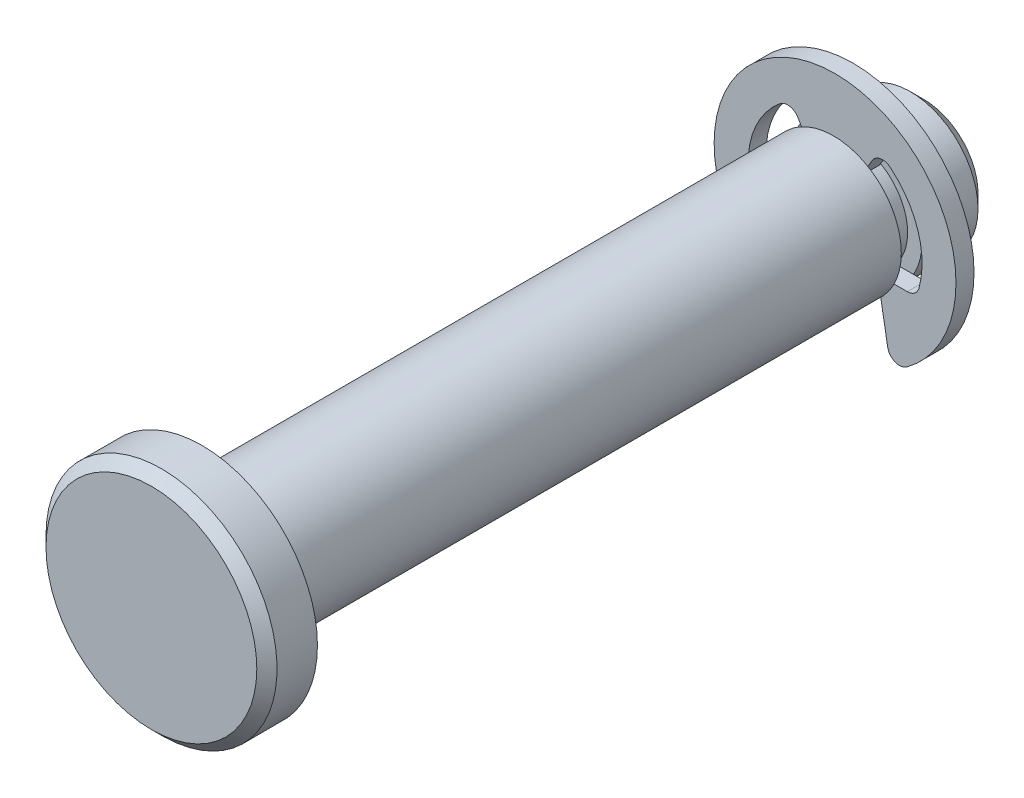
ISO-10303-21;
HEADER;
FILE_DESCRIPTION(('STEP AP214'),'2;1');
FILE_NAME('part.step','',(''),(''),'','','');
FILE_SCHEMA(('AUTOMOTIVE_DESIGN { 1 0 10303 214 1 1 1 1 }'));
ENDSEC;
DATA;
#1=APPLICATION_CONTEXT('core data for automotive mechanical design processes');
#2=APPLICATION_PROTOCOL_DEFINITION('international standard','automotive_design',2000,#1);
#3=PRODUCT_CONTEXT('',#1,'mechanical');
#4=PRODUCT('Part','Part','',(#3));
#5=PRODUCT_RELATED_PRODUCT_CATEGORY('part','',(#4));
#6=PRODUCT_DEFINITION_FORMATION('','',#4);
#7=PRODUCT_DEFINITION_CONTEXT('part definition',#1,'design');
#8=PRODUCT_DEFINITION('design','',#6,#7);
#9=PRODUCT_DEFINITION_SHAPE('','',#8);
#10=(LENGTH_UNIT() NAMED_UNIT(*) SI_UNIT(.MILLI.,.METRE.));
#11=(NAMED_UNIT(*) PLANE_ANGLE_UNIT() SI_UNIT($,.RADIAN.));
#12=(NAMED_UNIT(*) SI_UNIT($,.STERADIAN.) SOLID_ANGLE_UNIT());
#13=UNCERTAINTY_MEASURE_WITH_UNIT(LENGTH_MEASURE(1.E-05),#10,'distance_accuracy_value','');
#14=(GEOMETRIC_REPRESENTATION_CONTEXT(3) GLOBAL_UNCERTAINTY_ASSIGNED_CONTEXT((#13)) GLOBAL_UNIT_ASSIGNED_CONTEXT((#10,
#11,#12)) REPRESENTATION_CONTEXT('',''));
#15=CARTESIAN_POINT('',(0.,0.,0.));
#16=DIRECTION('',(0.,0.,1.));
#17=DIRECTION('',(1.,0.,0.));
#18=AXIS2_PLACEMENT_3D('',#15,#16,#17);
#19=CARTESIAN_POINT('',(0.,0.,-9.5758));
#20=DIRECTION('',(0.,0.,1.));
#21=DIRECTION('',(1.,0.,0.));
#22=AXIS2_PLACEMENT_3D('',#19,#20,#21);
#23=PLANE('',#22);
#24=DIRECTION('',(-0.173648177666931,0.984807753012208,0.));
#25=VECTOR('',#24,1.);
#26=CARTESIAN_POINT('',(1.25692963982568,0.22163060835344,-9.5758));
#27=LINE('',#26,#25);
#28=CARTESIAN_POINT('',(1.85256069501915,-3.15636096616503,-9.5758));
#29=VERTEX_POINT('',#28);
#30=CARTESIAN_POINT('',(1.49352,-1.12014,-9.5758));
#31=VERTEX_POINT('',#30);
#32=EDGE_CURVE('E200',#29,#31,#27,.T.);
#33=ORIENTED_EDGE('',*,*,#32,.F.);
#34=CARTESIAN_POINT('',(2.2715471535382,-3.08248234897663,-9.5758));
#35=DIRECTION('',(0.,0.,1.));
#36=DIRECTION('',(1.,0.,0.));
#37=AXIS2_PLACEMENT_3D('',#34,#35,#36);
#38=CIRCLE('',#37,0.42545);
#39=CARTESIAN_POINT('',(2.52394128170911,-3.42498038775182,-9.5758));
#40=VERTEX_POINT('',#39);
#41=EDGE_CURVE('E254',#29,#40,#38,.T.);
#42=ORIENTED_EDGE('',*,*,#41,.T.);
#43=CARTESIAN_POINT('',(0.,0.,-9.5758));
#44=DIRECTION('',(0.,0.,1.));
#45=DIRECTION('',(1.,0.,0.));
#46=AXIS2_PLACEMENT_3D('',#43,#44,#45);
#47=CIRCLE('',#46,4.2545);
#48=CARTESIAN_POINT('',(-2.52394128170911,-3.42498038775182,-9.5758));
#49=VERTEX_POINT('',#48);
#50=EDGE_CURVE('E180',#40,#49,#47,.T.);
#51=ORIENTED_EDGE('',*,*,#50,.T.);
#52=CARTESIAN_POINT('',(-2.2715471535382,-3.08248234897663,-9.5758));
#53=DIRECTION('',(0.,0.,1.));
#54=DIRECTION('',(1.,0.,0.));
#55=AXIS2_PLACEMENT_3D('',#52,#53,#54);
#56=CIRCLE('',#55,0.42545);
#57=CARTESIAN_POINT('',(-1.85256069501915,-3.15636096616503,-9.5758));
#58=VERTEX_POINT('',#57);
#59=EDGE_CURVE('E252',#49,#58,#56,.T.);
#60=ORIENTED_EDGE('',*,*,#59,.T.);
#61=DIRECTION('',(-0.173648177666931,-0.984807753012208,0.));
#62=VECTOR('',#61,1.);
#63=CARTESIAN_POINT('',(-1.25692963982568,0.22163060835344,-9.5758));
#64=LINE('',#63,#62);
#65=CARTESIAN_POINT('',(-1.49352,-1.12014,-9.5758));
#66=VERTEX_POINT('',#65);
#67=EDGE_CURVE('E196',#66,#58,#64,.T.);
#68=ORIENTED_EDGE('',*,*,#67,.F.);
#69=DIRECTION('',(1.,0.,0.));
#70=VECTOR('',#69,1.);
#71=CARTESIAN_POINT('',(0.,-1.12014,-9.5758));
#72=LINE('',#71,#70);
#73=CARTESIAN_POINT('',(-2.54203626378539,-1.12014,-9.5758));
#74=VERTEX_POINT('',#73);
#75=EDGE_CURVE('E187',#74,#66,#72,.T.);
#76=ORIENTED_EDGE('',*,*,#75,.F.);
#77=CARTESIAN_POINT('',(-2.54203626378539,-0.69469,-9.5758));
#78=DIRECTION('',(0.,0.,1.));
#79=DIRECTION('',(1.,0.,0.));
#80=AXIS2_PLACEMENT_3D('',#77,#78,#79);
#81=CIRCLE('',#80,0.42545);
#82=CARTESIAN_POINT('',(-2.95243729914352,-0.806844771084337,-9.5758));
#83=VERTEX_POINT('',#82);
#84=EDGE_CURVE('E52',#74,#83,#81,.F.);
#85=ORIENTED_EDGE('',*,*,#84,.T.);
#86=CARTESIAN_POINT('',(0.,0.,-9.5758));
#87=DIRECTION('',(0.,0.,1.));
#88=DIRECTION('',(1.,0.,0.));
#89=AXIS2_PLACEMENT_3D('',#86,#87,#88);
#90=CIRCLE('',#89,3.0607);
#91=CARTESIAN_POINT('',(-1.93820951958955,2.36880314677528,-9.5758));
#92=VERTEX_POINT('',#91);
#93=EDGE_CURVE('E212',#92,#83,#90,.T.);
#94=ORIENTED_EDGE('',*,*,#93,.F.);
#95=CARTESIAN_POINT('',(-1.66879035400345,2.03952968031481,-9.5758));
#96=DIRECTION('',(0.,0.,1.));
#97=DIRECTION('',(1.,0.,0.));
#98=AXIS2_PLACEMENT_3D('',#95,#96,#97);
#99=CIRCLE('',#98,0.42545);
#100=CARTESIAN_POINT('',(-1.30033984596336,2.25225468031482,-9.5758));
#101=VERTEX_POINT('',#100);
#102=EDGE_CURVE('E184',#92,#101,#99,.F.);
#103=ORIENTED_EDGE('',*,*,#102,.T.);
#104=DIRECTION('',(-0.500000000000002,0.866025403784438,0.));
#105=VECTOR('',#104,1.);
#106=CARTESIAN_POINT('',(0.,0.,-9.5758));
#107=LINE('',#106,#105);
#108=CARTESIAN_POINT('',(-0.933450000000003,1.61678282632517,-9.5758));
#109=VERTEX_POINT('',#108);
#110=EDGE_CURVE('E176',#109,#101,#107,.T.);
#111=ORIENTED_EDGE('',*,*,#110,.F.);
#112=DIRECTION('',(1.,0.,0.));
#113=VECTOR('',#112,1.);
#114=CARTESIAN_POINT('',(-0.933450000000003,1.61678282632517,-9.5758));
#115=LINE('',#114,#113);
#116=CARTESIAN_POINT('',(0.933450000000003,1.61678282632517,-9.5758));
#117=VERTEX_POINT('',#116);
#118=EDGE_CURVE('E160',#109,#117,#115,.T.);
#119=ORIENTED_EDGE('',*,*,#118,.T.);
#120=DIRECTION('',(-0.500000000000002,-0.866025403784438,0.));
#121=VECTOR('',#120,1.);
#122=CARTESIAN_POINT('',(0.,0.,-9.5758));
#123=LINE('',#122,#121);
#124=CARTESIAN_POINT('',(1.30033984596336,2.25225468031482,-9.5758));
#125=VERTEX_POINT('',#124);
#126=EDGE_CURVE('E210',#125,#117,#123,.T.);
#127=ORIENTED_EDGE('',*,*,#126,.F.);
#128=CARTESIAN_POINT('',(1.66879035400345,2.03952968031482,-9.5758));
#129=DIRECTION('',(0.,0.,1.));
#130=DIRECTION('',(1.,0.,0.));
#131=AXIS2_PLACEMENT_3D('',#128,#129,#130);
#132=CIRCLE('',#131,0.42545);
#133=CARTESIAN_POINT('',(1.93820951958955,2.36880314677528,-9.5758));
#134=VERTEX_POINT('',#133);
#135=EDGE_CURVE('E269',#125,#134,#132,.F.);
#136=ORIENTED_EDGE('',*,*,#135,.T.);
#137=CARTESIAN_POINT('',(0.,0.,-9.5758));
#138=DIRECTION('',(0.,0.,1.));
#139=DIRECTION('',(1.,0.,0.));
#140=AXIS2_PLACEMENT_3D('',#137,#138,#139);
#141=CIRCLE('',#140,3.0607);
#142=CARTESIAN_POINT('',(2.95243729914352,-0.806844771084337,-9.5758));
#143=VERTEX_POINT('',#142);
#144=EDGE_CURVE('E215',#143,#134,#141,.T.);
#145=ORIENTED_EDGE('',*,*,#144,.F.);
#146=CARTESIAN_POINT('',(2.54203626378539,-0.69469,-9.5758));
#147=DIRECTION('',(0.,0.,1.));
#148=DIRECTION('',(1.,0.,0.));
#149=AXIS2_PLACEMENT_3D('',#146,#147,#148);
#150=CIRCLE('',#149,0.42545);
#151=CARTESIAN_POINT('',(2.54203626378539,-1.12014,-9.5758));
#152=VERTEX_POINT('',#151);
#153=EDGE_CURVE('E265',#143,#152,#150,.F.);
#154=ORIENTED_EDGE('',*,*,#153,.T.);
#155=DIRECTION('',(1.,0.,0.));
#156=VECTOR('',#155,1.);
#157=CARTESIAN_POINT('',(0.,-1.12014,-9.5758));
#158=LINE('',#157,#156);
#159=EDGE_CURVE('E205',#31,#152,#158,.T.);
#160=ORIENTED_EDGE('',*,*,#159,.F.);
#161=EDGE_LOOP('',(#33,#42,#51,#60,#68,#76,#85,#94,#103,#111,#119,#127,#136,#145,#154,#160));
#162=FACE_BOUND('',#161,.T.);
#163=ADVANCED_FACE('F44',(#162),#23,.T.);
#164=CARTESIAN_POINT('',(0.,0.,-10.2108));
#165=DIRECTION('',(0.,0.,1.));
#166=DIRECTION('',(1.,0.,0.));
#167=AXIS2_PLACEMENT_3D('',#164,#165,#166);
#168=PLANE('',#167);
#169=CARTESIAN_POINT('',(0.,0.,-10.2108));
#170=DIRECTION('',(0.,0.,1.));
#171=DIRECTION('',(1.,0.,0.));
#172=AXIS2_PLACEMENT_3D('',#169,#170,#171);
#173=CIRCLE('',#172,4.2545);
#174=CARTESIAN_POINT('',(2.52394128170911,-3.42498038775182,-10.2108));
#175=VERTEX_POINT('',#174);
#176=CARTESIAN_POINT('',(-2.52394128170911,-3.42498038775182,-10.2108));
#177=VERTEX_POINT('',#176);
#178=EDGE_CURVE('E218',#175,#177,#173,.T.);
#179=ORIENTED_EDGE('',*,*,#178,.F.);
#180=CARTESIAN_POINT('',(2.2715471535382,-3.08248234897663,-10.2108));
#181=DIRECTION('',(0.,0.,1.));
#182=DIRECTION('',(1.,0.,0.));
#183=AXIS2_PLACEMENT_3D('',#180,#181,#182);
#184=CIRCLE('',#183,0.42545);
#185=CARTESIAN_POINT('',(1.85256069501915,-3.15636096616503,-10.2108));
#186=VERTEX_POINT('',#185);
#187=EDGE_CURVE('E262',#175,#186,#184,.F.);
#188=ORIENTED_EDGE('',*,*,#187,.T.);
#189=DIRECTION('',(-0.173648177666931,0.984807753012208,0.));
#190=VECTOR('',#189,1.);
#191=CARTESIAN_POINT('',(1.25692963982568,0.22163060835344,-10.2108));
#192=LINE('',#191,#190);
#193=CARTESIAN_POINT('',(1.49352,-1.12014,-10.2108));
#194=VERTEX_POINT('',#193);
#195=EDGE_CURVE('E198',#186,#194,#192,.T.);
#196=ORIENTED_EDGE('',*,*,#195,.T.);
#197=DIRECTION('',(1.,0.,0.));
#198=VECTOR('',#197,1.);
#199=CARTESIAN_POINT('',(0.,-1.12014,-10.2108));
#200=LINE('',#199,#198);
#201=CARTESIAN_POINT('',(2.54203626378539,-1.12014,-10.2108));
#202=VERTEX_POINT('',#201);
#203=EDGE_CURVE('E202',#194,#202,#200,.T.);
#204=ORIENTED_EDGE('',*,*,#203,.T.);
#205=CARTESIAN_POINT('',(2.54203626378539,-0.69469,-10.2108));
#206=DIRECTION('',(0.,0.,1.));
#207=DIRECTION('',(1.,0.,0.));
#208=AXIS2_PLACEMENT_3D('',#205,#206,#207);
#209=CIRCLE('',#208,0.42545);
#210=CARTESIAN_POINT('',(2.95243729914352,-0.806844771084337,-10.2108));
#211=VERTEX_POINT('',#210);
#212=EDGE_CURVE('E267',#202,#211,#209,.T.);
#213=ORIENTED_EDGE('',*,*,#212,.T.);
#214=CARTESIAN_POINT('',(0.,0.,-10.2108));
#215=DIRECTION('',(0.,0.,1.));
#216=DIRECTION('',(1.,0.,0.));
#217=AXIS2_PLACEMENT_3D('',#214,#215,#216);
#218=CIRCLE('',#217,3.0607);
#219=CARTESIAN_POINT('',(1.93820951958955,2.36880314677528,-10.2108));
#220=VERTEX_POINT('',#219);
#221=EDGE_CURVE('E226',#211,#220,#218,.T.);
#222=ORIENTED_EDGE('',*,*,#221,.T.);
#223=CARTESIAN_POINT('',(1.66879035400345,2.03952968031482,-10.2108));
#224=DIRECTION('',(0.,0.,1.));
#225=DIRECTION('',(1.,0.,0.));
#226=AXIS2_PLACEMENT_3D('',#223,#224,#225);
#227=CIRCLE('',#226,0.42545);
#228=CARTESIAN_POINT('',(1.30033984596336,2.25225468031482,-10.2108));
#229=VERTEX_POINT('',#228);
#230=EDGE_CURVE('E271',#220,#229,#227,.T.);
#231=ORIENTED_EDGE('',*,*,#230,.T.);
#232=DIRECTION('',(-0.500000000000002,-0.866025403784438,0.));
#233=VECTOR('',#232,1.);
#234=CARTESIAN_POINT('',(0.,0.,-10.2108));
#235=LINE('',#234,#233);
#236=CARTESIAN_POINT('',(0.933450000000003,1.61678282632517,-10.2108));
#237=VERTEX_POINT('',#236);
#238=EDGE_CURVE('E208',#229,#237,#235,.T.);
#239=ORIENTED_EDGE('',*,*,#238,.T.);
#240=DIRECTION('',(-1.,0.,0.));
#241=VECTOR('',#240,1.);
#242=CARTESIAN_POINT('',(-0.933450000000003,1.61678282632517,-10.2108));
#243=LINE('',#242,#241);
#244=CARTESIAN_POINT('',(-0.933450000000003,1.61678282632517,-10.2108));
#245=VERTEX_POINT('',#244);
#246=EDGE_CURVE('E171',#237,#245,#243,.T.);
#247=ORIENTED_EDGE('',*,*,#246,.T.);
#248=DIRECTION('',(-0.500000000000002,0.866025403784438,0.));
#249=VECTOR('',#248,1.);
#250=CARTESIAN_POINT('',(0.,0.,-10.2108));
#251=LINE('',#250,#249);
#252=CARTESIAN_POINT('',(-1.30033984596336,2.25225468031482,-10.2108));
#253=VERTEX_POINT('',#252);
#254=EDGE_CURVE('E179',#245,#253,#251,.T.);
#255=ORIENTED_EDGE('',*,*,#254,.T.);
#256=CARTESIAN_POINT('',(-1.66879035400345,2.03952968031481,-10.2108));
#257=DIRECTION('',(0.,0.,1.));
#258=DIRECTION('',(1.,0.,0.));
#259=AXIS2_PLACEMENT_3D('',#256,#257,#258);
#260=CIRCLE('',#259,0.42545);
#261=CARTESIAN_POINT('',(-1.93820951958955,2.36880314677528,-10.2108));
#262=VERTEX_POINT('',#261);
#263=EDGE_CURVE('E274',#253,#262,#260,.T.);
#264=ORIENTED_EDGE('',*,*,#263,.T.);
#265=CARTESIAN_POINT('',(0.,0.,-10.2108));
#266=DIRECTION('',(0.,0.,1.));
#267=DIRECTION('',(1.,0.,0.));
#268=AXIS2_PLACEMENT_3D('',#265,#266,#267);
#269=CIRCLE('',#268,3.0607);
#270=CARTESIAN_POINT('',(-2.95243729914352,-0.806844771084337,-10.2108));
#271=VERTEX_POINT('',#270);
#272=EDGE_CURVE('E223',#262,#271,#269,.T.);
#273=ORIENTED_EDGE('',*,*,#272,.T.);
#274=CARTESIAN_POINT('',(-2.54203626378539,-0.69469,-10.2108));
#275=DIRECTION('',(0.,0.,1.));
#276=DIRECTION('',(1.,0.,0.));
#277=AXIS2_PLACEMENT_3D('',#274,#275,#276);
#278=CIRCLE('',#277,0.42545);
#279=CARTESIAN_POINT('',(-2.54203626378539,-1.12014,-10.2108));
#280=VERTEX_POINT('',#279);
#281=EDGE_CURVE('E13',#271,#280,#278,.T.);
#282=ORIENTED_EDGE('',*,*,#281,.T.);
#283=DIRECTION('',(1.,0.,0.));
#284=VECTOR('',#283,1.);
#285=CARTESIAN_POINT('',(0.,-1.12014,-10.2108));
#286=LINE('',#285,#284);
#287=CARTESIAN_POINT('',(-1.49352,-1.12014,-10.2108));
#288=VERTEX_POINT('',#287);
#289=EDGE_CURVE('E185',#280,#288,#286,.T.);
#290=ORIENTED_EDGE('',*,*,#289,.T.);
#291=DIRECTION('',(-0.173648177666931,-0.984807753012208,0.));
#292=VECTOR('',#291,1.);
#293=CARTESIAN_POINT('',(-1.25692963982568,0.22163060835344,-10.2108));
#294=LINE('',#293,#292);
#295=CARTESIAN_POINT('',(-1.85256069501915,-3.15636096616503,-10.2108));
#296=VERTEX_POINT('',#295);
#297=EDGE_CURVE('E194',#288,#296,#294,.T.);
#298=ORIENTED_EDGE('',*,*,#297,.T.);
#299=CARTESIAN_POINT('',(-2.2715471535382,-3.08248234897663,-10.2108));
#300=DIRECTION('',(0.,0.,1.));
#301=DIRECTION('',(1.,0.,0.));
#302=AXIS2_PLACEMENT_3D('',#299,#300,#301);
#303=CIRCLE('',#302,0.42545);
#304=EDGE_CURVE('E66',#296,#177,#303,.F.);
#305=ORIENTED_EDGE('',*,*,#304,.T.);
#306=EDGE_LOOP('',(#179,#188,#196,#204,#213,#222,#231,#239,#247,#255,#264,#273,#282,#290,#298,#305));
#307=FACE_BOUND('',#306,.T.);
#308=ADVANCED_FACE('F287',(#307),#168,.F.);
#309=CARTESIAN_POINT('',(0.,0.,-9.5758));
#310=DIRECTION('',(0.,0.,-1.));
#311=DIRECTION('',(-1.,0.,0.));
#312=AXIS2_PLACEMENT_3D('',#309,#310,#311);
#313=CYLINDRICAL_SURFACE('',#312,4.2545);
#314=ORIENTED_EDGE('',*,*,#50,.F.);
#315=DIRECTION('',(0.,0.,-1.));
#316=VECTOR('',#315,1.);
#317=CARTESIAN_POINT('',(2.52394128170911,-3.42498038775182,-9.5758));
#318=LINE('',#317,#316);
#319=EDGE_CURVE('E259',#40,#175,#318,.T.);
#320=ORIENTED_EDGE('',*,*,#319,.T.);
#321=ORIENTED_EDGE('',*,*,#178,.T.);
#322=DIRECTION('',(0.,0.,-1.));
#323=VECTOR('',#322,1.);
#324=CARTESIAN_POINT('',(-2.52394128170911,-3.42498038775182,-9.5758));
#325=LINE('',#324,#323);
#326=EDGE_CURVE('E256',#177,#49,#325,.F.);
#327=ORIENTED_EDGE('',*,*,#326,.T.);
#328=EDGE_LOOP('',(#314,#320,#321,#327));
#329=FACE_BOUND('',#328,.T.);
#330=ADVANCED_FACE('F327',(#329),#313,.T.);
#331=CARTESIAN_POINT('',(-1.49352,-1.12014,-12.7));
#332=DIRECTION('',(-0.984807753012208,0.173648177666931,0.));
#333=DIRECTION('',(-0.173648177666931,-0.984807753012208,0.));
#334=AXIS2_PLACEMENT_3D('',#331,#332,#333);
#335=PLANE('',#334);
#336=ORIENTED_EDGE('',*,*,#67,.T.);
#337=DIRECTION('',(0.,0.,-1.));
#338=VECTOR('',#337,1.);
#339=CARTESIAN_POINT('',(-1.85256069501915,-3.15636096616503,-12.7));
#340=LINE('',#339,#338);
#341=EDGE_CURVE('E59',#58,#296,#340,.T.);
#342=ORIENTED_EDGE('',*,*,#341,.T.);
#343=ORIENTED_EDGE('',*,*,#297,.F.);
#344=DIRECTION('',(0.,0.,1.));
#345=VECTOR('',#344,1.);
#346=CARTESIAN_POINT('',(-1.49352,-1.12014,-12.7));
#347=LINE('',#346,#345);
#348=EDGE_CURVE('E292',#288,#66,#347,.T.);
#349=ORIENTED_EDGE('',*,*,#348,.T.);
#350=EDGE_LOOP('',(#336,#342,#343,#349));
#351=FACE_BOUND('',#350,.T.);
#352=ADVANCED_FACE('F332',(#351),#335,.F.);
#353=CARTESIAN_POINT('',(-1.53035,2.65064395336303,-12.7));
#354=DIRECTION('',(0.866025403784438,0.500000000000002,0.));
#355=DIRECTION('',(-0.500000000000002,0.866025403784438,0.));
#356=AXIS2_PLACEMENT_3D('',#353,#354,#355);
#357=PLANE('',#356);
#358=ORIENTED_EDGE('',*,*,#110,.T.);
#359=DIRECTION('',(0.,0.,-1.));
#360=VECTOR('',#359,1.);
#361=CARTESIAN_POINT('',(-1.30033984596336,2.25225468031482,-10.2108));
#362=LINE('',#361,#360);
#363=EDGE_CURVE('E244',#101,#253,#362,.T.);
#364=ORIENTED_EDGE('',*,*,#363,.T.);
#365=ORIENTED_EDGE('',*,*,#254,.F.);
#366=DIRECTION('',(0.,0.,-1.));
#367=VECTOR('',#366,1.);
#368=CARTESIAN_POINT('',(-0.933450000000003,1.61678282632517,-9.5758));
#369=LINE('',#368,#367);
#370=EDGE_CURVE('E164',#245,#109,#369,.F.);
#371=ORIENTED_EDGE('',*,*,#370,.T.);
#372=EDGE_LOOP('',(#358,#364,#365,#371));
#373=FACE_BOUND('',#372,.T.);
#374=ADVANCED_FACE('F175',(#373),#357,.F.);
#375=CARTESIAN_POINT('',(0.,0.,-12.7));
#376=DIRECTION('',(0.,0.,1.));
#377=DIRECTION('',(1.,0.,0.));
#378=AXIS2_PLACEMENT_3D('',#375,#376,#377);
#379=CYLINDRICAL_SURFACE('',#378,3.0607);
#380=ORIENTED_EDGE('',*,*,#272,.F.);
#381=DIRECTION('',(0.,0.,1.));
#382=VECTOR('',#381,1.);
#383=CARTESIAN_POINT('',(-1.93820951958955,2.36880314677528,-12.7));
#384=LINE('',#383,#382);
#385=EDGE_CURVE('E241',#262,#92,#384,.T.);
#386=ORIENTED_EDGE('',*,*,#385,.T.);
#387=ORIENTED_EDGE('',*,*,#93,.T.);
#388=DIRECTION('',(0.,0.,1.));
#389=VECTOR('',#388,1.);
#390=CARTESIAN_POINT('',(-2.95243729914352,-0.806844771084337,-12.7));
#391=LINE('',#390,#389);
#392=EDGE_CURVE('E239',#83,#271,#391,.F.);
#393=ORIENTED_EDGE('',*,*,#392,.T.);
#394=EDGE_LOOP('',(#380,#386,#387,#393));
#395=FACE_BOUND('',#394,.T.);
#396=ADVANCED_FACE('F282',(#395),#379,.F.);
#397=CARTESIAN_POINT('',(-2.84836284036989,-1.12014,-12.7));
#398=DIRECTION('',(0.,-1.,0.));
#399=DIRECTION('',(0.,0.,-1.));
#400=AXIS2_PLACEMENT_3D('',#397,#398,#399);
#401=PLANE('',#400);
#402=ORIENTED_EDGE('',*,*,#289,.F.);
#403=DIRECTION('',(0.,0.,-1.));
#404=VECTOR('',#403,1.);
#405=CARTESIAN_POINT('',(-2.54203626378539,-1.12014,-9.5758));
#406=LINE('',#405,#404);
#407=EDGE_CURVE('E246',#280,#74,#406,.F.);
#408=ORIENTED_EDGE('',*,*,#407,.T.);
#409=ORIENTED_EDGE('',*,*,#75,.T.);
#410=ORIENTED_EDGE('',*,*,#348,.F.);
#411=EDGE_LOOP('',(#402,#408,#409,#410));
#412=FACE_BOUND('',#411,.T.);
#413=ADVANCED_FACE('F290',(#412),#401,.F.);
#414=CARTESIAN_POINT('',(0.,0.,-12.7));
#415=DIRECTION('',(0.,0.,1.));
#416=DIRECTION('',(1.,0.,0.));
#417=AXIS2_PLACEMENT_3D('',#414,#415,#416);
#418=CYLINDRICAL_SURFACE('',#417,3.0607);
#419=ORIENTED_EDGE('',*,*,#221,.F.);
#420=DIRECTION('',(0.,0.,1.));
#421=VECTOR('',#420,1.);
#422=CARTESIAN_POINT('',(2.95243729914352,-0.806844771084337,-12.7));
#423=LINE('',#422,#421);
#424=EDGE_CURVE('E231',#211,#143,#423,.T.);
#425=ORIENTED_EDGE('',*,*,#424,.T.);
#426=ORIENTED_EDGE('',*,*,#144,.T.);
#427=DIRECTION('',(0.,0.,1.));
#428=VECTOR('',#427,1.);
#429=CARTESIAN_POINT('',(1.93820951958955,2.36880314677528,-12.7));
#430=LINE('',#429,#428);
#431=EDGE_CURVE('E229',#134,#220,#430,.F.);
#432=ORIENTED_EDGE('',*,*,#431,.T.);
#433=EDGE_LOOP('',(#419,#425,#426,#432));
#434=FACE_BOUND('',#433,.T.);
#435=ADVANCED_FACE('F306',(#434),#418,.F.);
#436=CARTESIAN_POINT('',(1.49352,-1.12014,-12.7));
#437=DIRECTION('',(0.,-1.,0.));
#438=DIRECTION('',(0.,0.,-1.));
#439=AXIS2_PLACEMENT_3D('',#436,#437,#438);
#440=PLANE('',#439);
#441=ORIENTED_EDGE('',*,*,#159,.T.);
#442=DIRECTION('',(0.,0.,-1.));
#443=VECTOR('',#442,1.);
#444=CARTESIAN_POINT('',(2.54203626378539,-1.12014,-10.2108));
#445=LINE('',#444,#443);
#446=EDGE_CURVE('E234',#152,#202,#445,.T.);
#447=ORIENTED_EDGE('',*,*,#446,.T.);
#448=ORIENTED_EDGE('',*,*,#203,.F.);
#449=DIRECTION('',(0.,0.,1.));
#450=VECTOR('',#449,1.);
#451=CARTESIAN_POINT('',(1.49352,-1.12014,-12.7));
#452=LINE('',#451,#450);
#453=EDGE_CURVE('E189',#194,#31,#452,.T.);
#454=ORIENTED_EDGE('',*,*,#453,.T.);
#455=EDGE_LOOP('',(#441,#447,#448,#454));
#456=FACE_BOUND('',#455,.T.);
#457=ADVANCED_FACE('F316',(#456),#440,.F.);
#458=CARTESIAN_POINT('',(1.49352,-1.12014,-12.7));
#459=DIRECTION('',(0.984807753012208,0.173648177666931,0.));
#460=DIRECTION('',(-0.173648177666931,0.984807753012208,0.));
#461=AXIS2_PLACEMENT_3D('',#458,#459,#460);
#462=PLANE('',#461);
#463=ORIENTED_EDGE('',*,*,#195,.F.);
#464=DIRECTION('',(0.,0.,-1.));
#465=VECTOR('',#464,1.);
#466=CARTESIAN_POINT('',(1.85256069501915,-3.15636096616503,-12.7));
#467=LINE('',#466,#465);
#468=EDGE_CURVE('E249',#186,#29,#467,.F.);
#469=ORIENTED_EDGE('',*,*,#468,.T.);
#470=ORIENTED_EDGE('',*,*,#32,.T.);
#471=ORIENTED_EDGE('',*,*,#453,.F.);
#472=EDGE_LOOP('',(#463,#469,#470,#471));
#473=FACE_BOUND('',#472,.T.);
#474=ADVANCED_FACE('F321',(#473),#462,.F.);
#475=CARTESIAN_POINT('',(0.,0.,-12.7));
#476=DIRECTION('',(-0.866025403784438,0.500000000000002,0.));
#477=DIRECTION('',(-0.500000000000002,-0.866025403784438,0.));
#478=AXIS2_PLACEMENT_3D('',#475,#476,#477);
#479=PLANE('',#478);
#480=ORIENTED_EDGE('',*,*,#238,.F.);
#481=DIRECTION('',(0.,0.,-1.));
#482=VECTOR('',#481,1.);
#483=CARTESIAN_POINT('',(1.30033984596336,2.25225468031482,-9.5758));
#484=LINE('',#483,#482);
#485=EDGE_CURVE('E236',#229,#125,#484,.F.);
#486=ORIENTED_EDGE('',*,*,#485,.T.);
#487=ORIENTED_EDGE('',*,*,#126,.T.);
#488=DIRECTION('',(0.,0.,-1.));
#489=VECTOR('',#488,1.);
#490=CARTESIAN_POINT('',(0.933450000000003,1.61678282632517,-9.5758));
#491=LINE('',#490,#489);
#492=EDGE_CURVE('E167',#117,#237,#491,.T.);
#493=ORIENTED_EDGE('',*,*,#492,.T.);
#494=EDGE_LOOP('',(#480,#486,#487,#493));
#495=FACE_BOUND('',#494,.T.);
#496=ADVANCED_FACE('F299',(#495),#479,.F.);
#497=CARTESIAN_POINT('',(-0.933450000000003,1.61678282632517,-12.0943801577228));
#498=DIRECTION('',(0.,-1.,0.));
#499=DIRECTION('',(0.,0.,-1.));
#500=AXIS2_PLACEMENT_3D('',#497,#498,#499);
#501=PLANE('',#500);
#502=ORIENTED_EDGE('',*,*,#246,.F.);
#503=ORIENTED_EDGE('',*,*,#492,.F.);
#504=ORIENTED_EDGE('',*,*,#118,.F.);
#505=ORIENTED_EDGE('',*,*,#370,.F.);
#506=EDGE_LOOP('',(#502,#503,#504,#505));
#507=FACE_BOUND('',#506,.T.);
#508=ADVANCED_FACE('F163',(#507),#501,.T.);
#509=CARTESIAN_POINT('',(2.54203626378539,-0.69469,-12.7));
#510=DIRECTION('',(0.,0.,1.));
#511=DIRECTION('',(1.,0.,0.));
#512=AXIS2_PLACEMENT_3D('',#509,#510,#511);
#513=CYLINDRICAL_SURFACE('',#512,0.42545);
#514=ORIENTED_EDGE('',*,*,#212,.F.);
#515=ORIENTED_EDGE('',*,*,#446,.F.);
#516=ORIENTED_EDGE('',*,*,#153,.F.);
#517=ORIENTED_EDGE('',*,*,#424,.F.);
#518=EDGE_LOOP('',(#514,#515,#516,#517));
#519=FACE_BOUND('',#518,.T.);
#520=ADVANCED_FACE('F312',(#519),#513,.F.);
#521=CARTESIAN_POINT('',(1.66879035400345,2.03952968031482,-12.7));
#522=DIRECTION('',(0.,0.,1.));
#523=DIRECTION('',(1.,0.,0.));
#524=AXIS2_PLACEMENT_3D('',#521,#522,#523);
#525=CYLINDRICAL_SURFACE('',#524,0.42545);
#526=ORIENTED_EDGE('',*,*,#230,.F.);
#527=ORIENTED_EDGE('',*,*,#431,.F.);
#528=ORIENTED_EDGE('',*,*,#135,.F.);
#529=ORIENTED_EDGE('',*,*,#485,.F.);
#530=EDGE_LOOP('',(#526,#527,#528,#529));
#531=FACE_BOUND('',#530,.T.);
#532=ADVANCED_FACE('F309',(#531),#525,.F.);
#533=CARTESIAN_POINT('',(-1.66879035400345,2.03952968031481,-12.7));
#534=DIRECTION('',(0.,0.,1.));
#535=DIRECTION('',(1.,0.,0.));
#536=AXIS2_PLACEMENT_3D('',#533,#534,#535);
#537=CYLINDRICAL_SURFACE('',#536,0.42545);
#538=ORIENTED_EDGE('',*,*,#263,.F.);
#539=ORIENTED_EDGE('',*,*,#363,.F.);
#540=ORIENTED_EDGE('',*,*,#102,.F.);
#541=ORIENTED_EDGE('',*,*,#385,.F.);
#542=EDGE_LOOP('',(#538,#539,#540,#541));
#543=FACE_BOUND('',#542,.T.);
#544=ADVANCED_FACE('F355',(#543),#537,.F.);
#545=CARTESIAN_POINT('',(-2.54203626378539,-0.69469,-12.7));
#546=DIRECTION('',(0.,0.,1.));
#547=DIRECTION('',(1.,0.,0.));
#548=AXIS2_PLACEMENT_3D('',#545,#546,#547);
#549=CYLINDRICAL_SURFACE('',#548,0.42545);
#550=ORIENTED_EDGE('',*,*,#281,.F.);
#551=ORIENTED_EDGE('',*,*,#392,.F.);
#552=ORIENTED_EDGE('',*,*,#84,.F.);
#553=ORIENTED_EDGE('',*,*,#407,.F.);
#554=EDGE_LOOP('',(#550,#551,#552,#553));
#555=FACE_BOUND('',#554,.T.);
#556=ADVANCED_FACE('F285',(#555),#549,.F.);
#557=CARTESIAN_POINT('',(2.2715471535382,-3.08248234897663,-9.5758));
#558=DIRECTION('',(0.,0.,-1.));
#559=DIRECTION('',(-1.,0.,0.));
#560=AXIS2_PLACEMENT_3D('',#557,#558,#559);
#561=CYLINDRICAL_SURFACE('',#560,0.42545);
#562=ORIENTED_EDGE('',*,*,#187,.F.);
#563=ORIENTED_EDGE('',*,*,#319,.F.);
#564=ORIENTED_EDGE('',*,*,#41,.F.);
#565=ORIENTED_EDGE('',*,*,#468,.F.);
#566=EDGE_LOOP('',(#562,#563,#564,#565));
#567=FACE_BOUND('',#566,.T.);
#568=ADVANCED_FACE('F330',(#567),#561,.T.);
#569=CARTESIAN_POINT('',(-2.2715471535382,-3.08248234897663,-9.5758));
#570=DIRECTION('',(0.,0.,-1.));
#571=DIRECTION('',(-1.,0.,0.));
#572=AXIS2_PLACEMENT_3D('',#569,#570,#571);
#573=CYLINDRICAL_SURFACE('',#572,0.42545);
#574=ORIENTED_EDGE('',*,*,#304,.F.);
#575=ORIENTED_EDGE('',*,*,#341,.F.);
#576=ORIENTED_EDGE('',*,*,#59,.F.);
#577=ORIENTED_EDGE('',*,*,#326,.F.);
#578=EDGE_LOOP('',(#574,#575,#576,#577));
#579=FACE_BOUND('',#578,.T.);
#580=ADVANCED_FACE('F46',(#579),#573,.T.);
#581=CLOSED_SHELL('',(#163,#308,#330,#352,#374,#396,#413,#435,#457,#474,#496,#508,#520,#532,
#544,#556,#568,#580));
#582=MANIFOLD_SOLID_BREP('B2',#581);
#583=CARTESIAN_POINT('',(0.,0.,12.7));
#584=DIRECTION('',(0.,0.,-1.));
#585=DIRECTION('',(-1.,0.,0.));
#586=AXIS2_PLACEMENT_3D('',#583,#584,#585);
#587=CYLINDRICAL_SURFACE('',#586,2.38125);
#588=CARTESIAN_POINT('',(0.,0.,12.7));
#589=DIRECTION('',(0.,0.,1.));
#590=DIRECTION('',(1.,0.,0.));
#591=AXIS2_PLACEMENT_3D('',#588,#589,#590);
#592=CIRCLE('',#591,2.38125);
#593=CARTESIAN_POINT('',(2.38125,0.,12.7));
#594=VERTEX_POINT('',#593);
#595=EDGE_CURVE('E506',#594,#594,#592,.T.);
#596=ORIENTED_EDGE('',*,*,#595,.F.);
#597=EDGE_LOOP('',(#596));
#598=FACE_BOUND('',#597,.T.);
#599=CARTESIAN_POINT('',(0.,0.,-9.525));
#600=DIRECTION('',(0.,0.,1.));
#601=DIRECTION('',(1.,0.,0.));
#602=AXIS2_PLACEMENT_3D('',#599,#600,#601);
#603=CIRCLE('',#602,2.38125);
#604=CARTESIAN_POINT('',(2.38125,0.,-9.525));
#605=VERTEX_POINT('',#604);
#606=EDGE_CURVE('E518',#605,#605,#603,.T.);
#607=ORIENTED_EDGE('',*,*,#606,.T.);
#608=EDGE_LOOP('',(#607));
#609=FACE_BOUND('',#608,.T.);
#610=ADVANCED_FACE('F486',(#598,#609),#587,.T.);
#611=CARTESIAN_POINT('',(0.,2.38125,-9.525));
#612=DIRECTION('',(0.,0.,-1.));
#613=DIRECTION('',(-1.,0.,0.));
#614=AXIS2_PLACEMENT_3D('',#611,#612,#613);
#615=PLANE('',#614);
#616=CARTESIAN_POINT('',(0.,0.,-9.525));
#617=DIRECTION('',(0.,0.,1.));
#618=DIRECTION('',(1.,0.,0.));
#619=AXIS2_PLACEMENT_3D('',#616,#617,#618);
#620=CIRCLE('',#619,1.8669);
#621=CARTESIAN_POINT('',(1.8669,0.,-9.525));
#622=VERTEX_POINT('',#621);
#623=EDGE_CURVE('E509',#622,#622,#620,.T.);
#624=ORIENTED_EDGE('',*,*,#623,.T.);
#625=EDGE_LOOP('',(#624));
#626=FACE_BOUND('',#625,.T.);
#627=ORIENTED_EDGE('',*,*,#606,.F.);
#628=EDGE_LOOP('',(#627));
#629=FACE_BOUND('',#628,.T.);
#630=ADVANCED_FACE('F536',(#626,#629),#615,.T.);
#631=CARTESIAN_POINT('',(0.,0.,12.7));
#632=DIRECTION('',(0.,0.,1.));
#633=DIRECTION('',(1.,0.,0.));
#634=AXIS2_PLACEMENT_3D('',#631,#632,#633);
#635=CYLINDRICAL_SURFACE('',#634,1.8669);
#636=CARTESIAN_POINT('',(0.,0.,-10.2616));
#637=DIRECTION('',(0.,0.,1.));
#638=DIRECTION('',(1.,0.,0.));
#639=AXIS2_PLACEMENT_3D('',#636,#637,#638);
#640=CIRCLE('',#639,1.8669);
#641=CARTESIAN_POINT('',(1.8669,0.,-10.2616));
#642=VERTEX_POINT('',#641);
#643=EDGE_CURVE('E512',#642,#642,#640,.T.);
#644=ORIENTED_EDGE('',*,*,#643,.T.);
#645=EDGE_LOOP('',(#644));
#646=FACE_BOUND('',#645,.T.);
#647=ORIENTED_EDGE('',*,*,#623,.F.);
#648=EDGE_LOOP('',(#647));
#649=FACE_BOUND('',#648,.T.);
#650=ADVANCED_FACE('F541',(#646,#649),#635,.T.);
#651=CARTESIAN_POINT('',(0.,2.38125,-10.2616));
#652=DIRECTION('',(0.,0.,1.));
#653=DIRECTION('',(1.,0.,0.));
#654=AXIS2_PLACEMENT_3D('',#651,#652,#653);
#655=PLANE('',#654);
#656=CARTESIAN_POINT('',(0.,0.,-10.2616));
#657=DIRECTION('',(0.,0.,1.));
#658=DIRECTION('',(1.,0.,0.));
#659=AXIS2_PLACEMENT_3D('',#656,#657,#658);
#660=CIRCLE('',#659,2.38125);
#661=CARTESIAN_POINT('',(2.38125,0.,-10.2616));
#662=VERTEX_POINT('',#661);
#663=EDGE_CURVE('E515',#662,#662,#660,.T.);
#664=ORIENTED_EDGE('',*,*,#663,.T.);
#665=EDGE_LOOP('',(#664));
#666=FACE_BOUND('',#665,.T.);
#667=ORIENTED_EDGE('',*,*,#643,.F.);
#668=EDGE_LOOP('',(#667));
#669=FACE_BOUND('',#668,.T.);
#670=ADVANCED_FACE('F547',(#666,#669),#655,.T.);
#671=CARTESIAN_POINT('',(0.,0.,-12.7));
#672=DIRECTION('',(0.,0.,1.));
#673=DIRECTION('',(1.,0.,0.));
#674=AXIS2_PLACEMENT_3D('',#671,#672,#673);
#675=PLANE('',#674);
#676=CARTESIAN_POINT('',(0.,0.,-12.7));
#677=DIRECTION('',(0.,0.,1.));
#678=DIRECTION('',(1.,0.,0.));
#679=AXIS2_PLACEMENT_3D('',#676,#677,#678);
#680=CIRCLE('',#679,1.905);
#681=CARTESIAN_POINT('',(1.905,0.,-12.7));
#682=VERTEX_POINT('',#681);
#683=EDGE_CURVE('E43',#682,#682,#680,.F.);
#684=ORIENTED_EDGE('',*,*,#683,.T.);
#685=EDGE_LOOP('',(#684));
#686=FACE_BOUND('',#685,.T.);
#687=ADVANCED_FACE('F552',(#686),#675,.F.);
#688=CARTESIAN_POINT('',(0.,0.,-12.22375));
#689=DIRECTION('',(0.,0.,1.));
#690=DIRECTION('',(1.,0.,0.));
#691=AXIS2_PLACEMENT_3D('',#688,#689,#690);
#692=CIRCLE('',#691,2.38125);
#693=CARTESIAN_POINT('',(2.38125,0.,-12.22375));
#694=VERTEX_POINT('',#693);
#695=EDGE_CURVE('E493',#694,#694,#692,.T.);
#696=ORIENTED_EDGE('',*,*,#695,.T.);
#697=EDGE_LOOP('',(#696));
#698=FACE_BOUND('',#697,.T.);
#699=ORIENTED_EDGE('',*,*,#663,.F.);
#700=EDGE_LOOP('',(#699));
#701=FACE_BOUND('',#700,.T.);
#702=ADVANCED_FACE('F530',(#698,#701),#587,.T.);
#703=CARTESIAN_POINT('',(0.,0.,12.7));
#704=DIRECTION('',(0.,0.,1.));
#705=DIRECTION('',(1.,0.,0.));
#706=AXIS2_PLACEMENT_3D('',#703,#704,#705);
#707=PLANE('',#706);
#708=CARTESIAN_POINT('',(0.,0.,12.7));
#709=DIRECTION('',(0.,0.,1.));
#710=DIRECTION('',(1.,0.,0.));
#711=AXIS2_PLACEMENT_3D('',#708,#709,#710);
#712=CIRCLE('',#711,4.064);
#713=CARTESIAN_POINT('',(4.064,0.,12.7));
#714=VERTEX_POINT('',#713);
#715=EDGE_CURVE('E521',#714,#714,#712,.T.);
#716=ORIENTED_EDGE('',*,*,#715,.F.);
#717=EDGE_LOOP('',(#716));
#718=FACE_BOUND('',#717,.T.);
#719=ORIENTED_EDGE('',*,*,#595,.T.);
#720=EDGE_LOOP('',(#719));
#721=FACE_BOUND('',#720,.T.);
#722=ADVANCED_FACE('F527',(#718,#721),#707,.F.);
#723=CARTESIAN_POINT('',(0.,0.,14.478));
#724=DIRECTION('',(0.,0.,-1.));
#725=DIRECTION('',(-1.,0.,0.));
#726=AXIS2_PLACEMENT_3D('',#723,#724,#725);
#727=CYLINDRICAL_SURFACE('',#726,4.064);
#728=CARTESIAN_POINT('',(0.,0.,14.1224));
#729=DIRECTION('',(0.,0.,1.));
#730=DIRECTION('',(1.,0.,0.));
#731=AXIS2_PLACEMENT_3D('',#728,#729,#730);
#732=CIRCLE('',#731,4.064);
#733=CARTESIAN_POINT('',(-4.064,0.,14.1224));
#734=VERTEX_POINT('',#733);
#735=EDGE_CURVE('E497',#734,#734,#732,.F.);
#736=ORIENTED_EDGE('',*,*,#735,.T.);
#737=EDGE_LOOP('',(#736));
#738=FACE_BOUND('',#737,.T.);
#739=ORIENTED_EDGE('',*,*,#715,.T.);
#740=EDGE_LOOP('',(#739));
#741=FACE_BOUND('',#740,.T.);
#742=ADVANCED_FACE('F525',(#738,#741),#727,.T.);
#743=CARTESIAN_POINT('',(0.,0.,14.478));
#744=DIRECTION('',(0.,0.,1.));
#745=DIRECTION('',(1.,0.,0.));
#746=AXIS2_PLACEMENT_3D('',#743,#744,#745);
#747=PLANE('',#746);
#748=CARTESIAN_POINT('',(0.,0.,14.478));
#749=DIRECTION('',(0.,0.,1.));
#750=DIRECTION('',(1.,0.,0.));
#751=AXIS2_PLACEMENT_3D('',#748,#749,#750);
#752=CIRCLE('',#751,3.7084);
#753=CARTESIAN_POINT('',(-3.7084,0.,14.478));
#754=VERTEX_POINT('',#753);
#755=EDGE_CURVE('E501',#754,#754,#752,.T.);
#756=ORIENTED_EDGE('',*,*,#755,.T.);
#757=EDGE_LOOP('',(#756));
#758=FACE_BOUND('',#757,.T.);
#759=ADVANCED_FACE('F556',(#758),#747,.T.);
#760=CARTESIAN_POINT('',(0.,0.,14.478));
#761=DIRECTION('',(0.,0.,-1.));
#762=DIRECTION('',(-1.,0.,0.));
#763=AXIS2_PLACEMENT_3D('',#760,#761,#762);
#764=CONICAL_SURFACE('',#763,3.7084,0.785398163397446);
#765=CARTESIAN_POINT('',(-4.064,0.,14.1224));
#766=CARTESIAN_POINT('',(-4.06029583333333,0.,14.1261041666667));
#767=CARTESIAN_POINT('',(-4.05659166666667,0.,14.1298083333333));
#768=CARTESIAN_POINT('',(-4.04918333333333,0.,14.1372166666667));
#769=CARTESIAN_POINT('',(-4.04547916666667,0.,14.1409208333333));
#770=CARTESIAN_POINT('',(-4.03807083333333,0.,14.1483291666667));
#771=CARTESIAN_POINT('',(-4.03436666666667,0.,14.1520333333333));
#772=CARTESIAN_POINT('',(-4.02695833333333,0.,14.1594416666667));
#773=CARTESIAN_POINT('',(-4.02325416666667,0.,14.1631458333333));
#774=CARTESIAN_POINT('',(-4.01584583333333,0.,14.1705541666667));
#775=CARTESIAN_POINT('',(-4.01214166666667,0.,14.1742583333333));
#776=CARTESIAN_POINT('',(-4.00473333333333,0.,14.1816666666667));
#777=CARTESIAN_POINT('',(-4.00102916666667,0.,14.1853708333333));
#778=CARTESIAN_POINT('',(-3.99362083333333,0.,14.1927791666667));
#779=CARTESIAN_POINT('',(-3.98991666666667,0.,14.1964833333333));
#780=CARTESIAN_POINT('',(-3.98250833333333,0.,14.2038916666667));
#781=CARTESIAN_POINT('',(-3.97880416666667,0.,14.2075958333333));
#782=CARTESIAN_POINT('',(-3.97139583333333,0.,14.2150041666667));
#783=CARTESIAN_POINT('',(-3.96769166666667,0.,14.2187083333333));
#784=CARTESIAN_POINT('',(-3.96028333333333,0.,14.2261166666667));
#785=CARTESIAN_POINT('',(-3.95657916666667,0.,14.2298208333333));
#786=CARTESIAN_POINT('',(-3.94917083333333,0.,14.2372291666667));
#787=CARTESIAN_POINT('',(-3.94546666666667,0.,14.2409333333333));
#788=CARTESIAN_POINT('',(-3.93805833333333,0.,14.2483416666667));
#789=CARTESIAN_POINT('',(-3.93435416666667,0.,14.2520458333333));
#790=CARTESIAN_POINT('',(-3.92694583333333,0.,14.2594541666667));
#791=CARTESIAN_POINT('',(-3.92324166666667,0.,14.2631583333333));
#792=CARTESIAN_POINT('',(-3.91583333333333,0.,14.2705666666667));
#793=CARTESIAN_POINT('',(-3.91212916666667,0.,14.2742708333333));
#794=CARTESIAN_POINT('',(-3.90472083333333,0.,14.2816791666667));
#795=CARTESIAN_POINT('',(-3.90101666666667,0.,14.2853833333333));
#796=CARTESIAN_POINT('',(-3.89360833333333,0.,14.2927916666667));
#797=CARTESIAN_POINT('',(-3.88990416666667,0.,14.2964958333333));
#798=CARTESIAN_POINT('',(-3.88249583333333,0.,14.3039041666667));
#799=CARTESIAN_POINT('',(-3.87879166666667,0.,14.3076083333333));
#800=CARTESIAN_POINT('',(-3.87138333333333,0.,14.3150166666667));
#801=CARTESIAN_POINT('',(-3.86767916666667,0.,14.3187208333333));
#802=CARTESIAN_POINT('',(-3.86027083333333,0.,14.3261291666667));
#803=CARTESIAN_POINT('',(-3.85656666666667,0.,14.3298333333333));
#804=CARTESIAN_POINT('',(-3.84915833333333,0.,14.3372416666667));
#805=CARTESIAN_POINT('',(-3.84545416666667,0.,14.3409458333333));
#806=CARTESIAN_POINT('',(-3.83804583333333,0.,14.3483541666667));
#807=CARTESIAN_POINT('',(-3.83434166666667,0.,14.3520583333333));
#808=CARTESIAN_POINT('',(-3.82693333333333,0.,14.3594666666667));
#809=CARTESIAN_POINT('',(-3.82322916666667,0.,14.3631708333333));
#810=CARTESIAN_POINT('',(-3.81582083333333,0.,14.3705791666667));
#811=CARTESIAN_POINT('',(-3.81211666666667,0.,14.3742833333333));
#812=CARTESIAN_POINT('',(-3.80470833333333,0.,14.3816916666667));
#813=CARTESIAN_POINT('',(-3.80100416666667,0.,14.3853958333333));
#814=CARTESIAN_POINT('',(-3.79359583333333,0.,14.3928041666667));
#815=CARTESIAN_POINT('',(-3.78989166666667,0.,14.3965083333333));
#816=CARTESIAN_POINT('',(-3.78248333333333,0.,14.4039166666667));
#817=CARTESIAN_POINT('',(-3.77877916666667,0.,14.4076208333333));
#818=CARTESIAN_POINT('',(-3.77137083333333,0.,14.4150291666667));
#819=CARTESIAN_POINT('',(-3.76766666666667,0.,14.4187333333333));
#820=CARTESIAN_POINT('',(-3.76025833333333,0.,14.4261416666667));
#821=CARTESIAN_POINT('',(-3.75655416666667,0.,14.4298458333333));
#822=CARTESIAN_POINT('',(-3.74914583333333,0.,14.4372541666667));
#823=CARTESIAN_POINT('',(-3.74544166666667,0.,14.4409583333333));
#824=CARTESIAN_POINT('',(-3.73803333333333,0.,14.4483666666667));
#825=CARTESIAN_POINT('',(-3.73432916666667,0.,14.4520708333333));
#826=CARTESIAN_POINT('',(-3.72692083333333,0.,14.4594791666667));
#827=CARTESIAN_POINT('',(-3.72321666666666,0.,14.4631833333333));
#828=CARTESIAN_POINT('',(-3.71580833333333,0.,14.4705916666667));
#829=CARTESIAN_POINT('',(-3.71210416666666,0.,14.4742958333333));
#830=CARTESIAN_POINT('',(-3.7084,0.,14.478));
#831=B_SPLINE_CURVE_WITH_KNOTS('',3,(#765,#766,#767,#768,#769,#770,#771,#772,#773,#774,#775,
#776,#777,#778,#779,#780,#781,#782,#783,#784,#785,#786,#787,#788,#789,#790,#791,#792,#793,#794,
#795,#796,#797,#798,#799,#800,#801,#802,#803,#804,#805,#806,#807,#808,#809,#810,#811,#812,#813,
#814,#815,#816,#817,#818,#819,#820,#821,#822,#823,#824,#825,#826,#827,#828,#829,#830),
.UNSPECIFIED.,.F.,.F.,(4,2,2,2,2,2,2,2,2,2,2,2,2,2,2,2,2,2,2,2,2,2,2,2,2,2,2,2,2,2,2,2,4),(0.,
0.0157154482118703,0.0314308964237412,0.0471463446356127,0.0628617928474843,0.0785772410593552,
0.0942926892712267,0.110008137483098,0.125723585694969,0.141439033906839,0.157154482118711,
0.172869930330583,0.188585378542453,0.204300826754325,0.220016274966196,0.235731723178068,
0.251447171389939,0.267162619601809,0.28287806781368,0.298593516025552,0.314308964237423,
0.330024412449294,0.345739860661166,0.361455308873037,0.377170757084908,0.392886205296778,
0.40860165350865,0.424317101720521,0.440032549932392,0.455747998144264,0.471463446356135,
0.487178894568007,0.502894342779878),.UNSPECIFIED.);
#832=EDGE_CURVE('BSEAM554',#734,#754,#831,.T.);
#833=ORIENTED_EDGE('',*,*,#735,.F.);
#834=ORIENTED_EDGE('',*,*,#755,.F.);
#835=ORIENTED_EDGE('',*,*,#832,.T.);
#836=ORIENTED_EDGE('',*,*,#832,.F.);
#837=EDGE_LOOP('',(#833,#835,#834,#836));
#838=FACE_BOUND('',#837,.T.);
#839=ADVANCED_FACE('F554',(#838),#764,.T.);
#840=CARTESIAN_POINT('',(0.,0.,-12.22375));
#841=DIRECTION('',(0.,0.,1.));
#842=DIRECTION('',(1.,0.,0.));
#843=AXIS2_PLACEMENT_3D('',#840,#841,#842);
#844=CONICAL_SURFACE('',#843,2.38125,0.785398163397451);
#845=ORIENTED_EDGE('',*,*,#683,.F.);
#846=EDGE_LOOP('',(#845));
#847=FACE_BOUND('',#846,.T.);
#848=ORIENTED_EDGE('',*,*,#695,.F.);
#849=EDGE_LOOP('',(#848));
#850=FACE_BOUND('',#849,.T.);
#851=ADVANCED_FACE('F488',(#847,#850),#844,.T.);
#852=CLOSED_SHELL('',(#610,#630,#650,#670,#687,#702,#722,#742,#759,#839,#851));
#853=MANIFOLD_SOLID_BREP('B7',#852);
#854=ADVANCED_BREP_SHAPE_REPRESENTATION('',(#18,#582,#853),#14);
#855=SHAPE_DEFINITION_REPRESENTATION(#9,#854);
ENDSEC;
END-ISO-10303-21;
